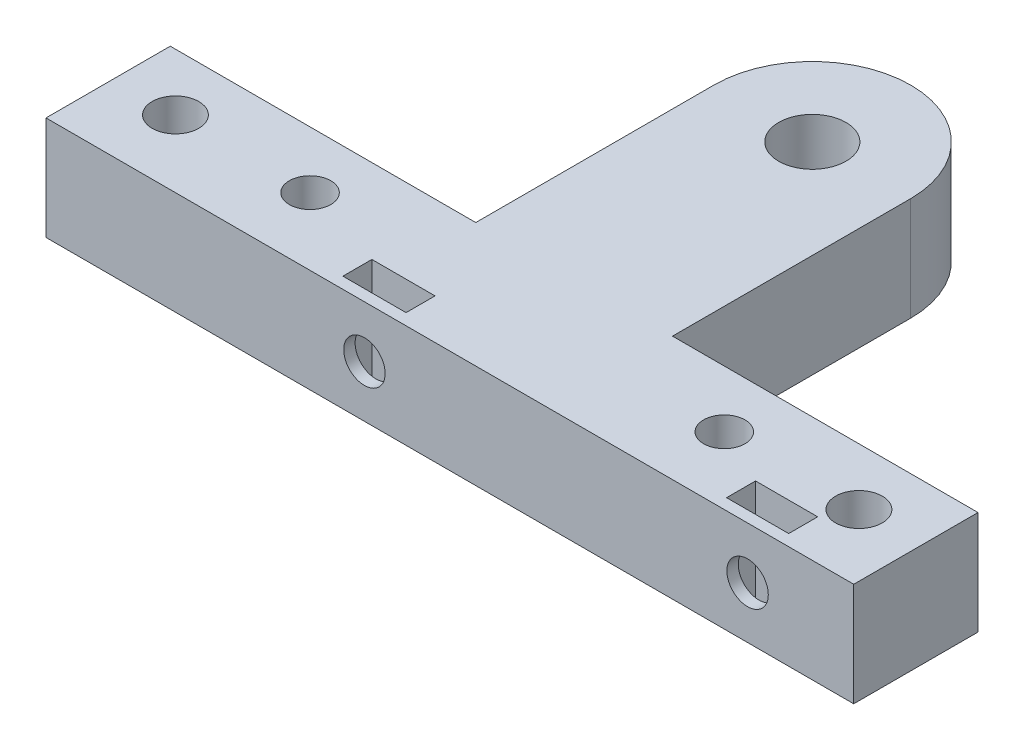
ISO-10303-21;
HEADER;
FILE_DESCRIPTION(('STEP AP214'),'2;1');
FILE_NAME('part.step','',(''),(''),'','','');
FILE_SCHEMA(('AUTOMOTIVE_DESIGN { 1 0 10303 214 1 1 1 1 }'));
ENDSEC;
DATA;
#1=APPLICATION_CONTEXT('core data for automotive mechanical design processes');
#2=APPLICATION_PROTOCOL_DEFINITION('international standard','automotive_design',2000,#1);
#3=PRODUCT_CONTEXT('',#1,'mechanical');
#4=PRODUCT('Part','Part','',(#3));
#5=PRODUCT_RELATED_PRODUCT_CATEGORY('part','',(#4));
#6=PRODUCT_DEFINITION_FORMATION('','',#4);
#7=PRODUCT_DEFINITION_CONTEXT('part definition',#1,'design');
#8=PRODUCT_DEFINITION('design','',#6,#7);
#9=PRODUCT_DEFINITION_SHAPE('','',#8);
#10=(LENGTH_UNIT() NAMED_UNIT(*) SI_UNIT(.MILLI.,.METRE.));
#11=(NAMED_UNIT(*) PLANE_ANGLE_UNIT() SI_UNIT($,.RADIAN.));
#12=(NAMED_UNIT(*) SI_UNIT($,.STERADIAN.) SOLID_ANGLE_UNIT());
#13=UNCERTAINTY_MEASURE_WITH_UNIT(LENGTH_MEASURE(1.E-05),#10,'distance_accuracy_value','');
#14=(GEOMETRIC_REPRESENTATION_CONTEXT(3) GLOBAL_UNCERTAINTY_ASSIGNED_CONTEXT((#13)) GLOBAL_UNIT_ASSIGNED_CONTEXT((#10,
#11,#12)) REPRESENTATION_CONTEXT('',''));
#15=CARTESIAN_POINT('',(0.,0.,0.));
#16=DIRECTION('',(0.,0.,1.));
#17=DIRECTION('',(1.,0.,0.));
#18=AXIS2_PLACEMENT_3D('',#15,#16,#17);
#19=CARTESIAN_POINT('',(28.75,5.,2.00000000000001));
#20=DIRECTION('',(0.,0.,1.));
#21=DIRECTION('',(1.,0.,0.));
#22=AXIS2_PLACEMENT_3D('',#19,#20,#21);
#23=CYLINDRICAL_SURFACE('',#22,2.);
#24=CARTESIAN_POINT('',(28.75,5.,4.9));
#25=DIRECTION('',(0.,0.,1.));
#26=DIRECTION('',(1.,0.,0.));
#27=AXIS2_PLACEMENT_3D('',#24,#25,#26);
#28=CIRCLE('',#27,2.);
#29=CARTESIAN_POINT('',(30.75,5.,4.9));
#30=VERTEX_POINT('',#29);
#31=EDGE_CURVE('E272',#30,#30,#28,.F.);
#32=ORIENTED_EDGE('',*,*,#31,.T.);
#33=EDGE_LOOP('',(#32));
#34=FACE_BOUND('',#33,.T.);
#35=CARTESIAN_POINT('',(28.75,5.,6.));
#36=DIRECTION('',(0.,0.,1.));
#37=DIRECTION('',(1.,0.,0.));
#38=AXIS2_PLACEMENT_3D('',#35,#36,#37);
#39=CIRCLE('',#38,2.);
#40=CARTESIAN_POINT('',(30.75,5.,6.));
#41=VERTEX_POINT('',#40);
#42=EDGE_CURVE('E269',#41,#41,#39,.T.);
#43=ORIENTED_EDGE('',*,*,#42,.T.);
#44=EDGE_LOOP('',(#43));
#45=FACE_BOUND('',#44,.T.);
#46=ADVANCED_FACE('F33',(#34,#45),#23,.F.);
#47=CARTESIAN_POINT('',(-8.25,5.,2.00000000000001));
#48=DIRECTION('',(0.,0.,1.));
#49=DIRECTION('',(1.,0.,0.));
#50=AXIS2_PLACEMENT_3D('',#47,#48,#49);
#51=CYLINDRICAL_SURFACE('',#50,2.);
#52=CARTESIAN_POINT('',(-8.25,5.,4.9));
#53=DIRECTION('',(0.,0.,1.));
#54=DIRECTION('',(1.,0.,0.));
#55=AXIS2_PLACEMENT_3D('',#52,#53,#54);
#56=CIRCLE('',#55,2.);
#57=CARTESIAN_POINT('',(-6.25,5.,4.9));
#58=VERTEX_POINT('',#57);
#59=EDGE_CURVE('E394',#58,#58,#56,.F.);
#60=ORIENTED_EDGE('',*,*,#59,.T.);
#61=EDGE_LOOP('',(#60));
#62=FACE_BOUND('',#61,.T.);
#63=CARTESIAN_POINT('',(-8.25,5.,6.));
#64=DIRECTION('',(0.,0.,1.));
#65=DIRECTION('',(1.,0.,0.));
#66=AXIS2_PLACEMENT_3D('',#63,#64,#65);
#67=CIRCLE('',#66,2.);
#68=CARTESIAN_POINT('',(-6.25,5.,6.));
#69=VERTEX_POINT('',#68);
#70=EDGE_CURVE('E263',#69,#69,#67,.T.);
#71=ORIENTED_EDGE('',*,*,#70,.T.);
#72=EDGE_LOOP('',(#71));
#73=FACE_BOUND('',#72,.T.);
#74=ADVANCED_FACE('F447',(#62,#73),#51,.F.);
#75=CARTESIAN_POINT('',(0.,10.,-29.));
#76=DIRECTION('',(0.,-1.,0.));
#77=DIRECTION('',(0.,0.,-1.));
#78=AXIS2_PLACEMENT_3D('',#75,#76,#77);
#79=CYLINDRICAL_SURFACE('',#78,3.25);
#80=CARTESIAN_POINT('',(0.,10.,-29.));
#81=DIRECTION('',(0.,1.,0.));
#82=DIRECTION('',(0.,0.,1.));
#83=AXIS2_PLACEMENT_3D('',#80,#81,#82);
#84=CIRCLE('',#83,3.25);
#85=CARTESIAN_POINT('',(0.,10.,-25.75));
#86=VERTEX_POINT('',#85);
#87=EDGE_CURVE('E331',#86,#86,#84,.T.);
#88=ORIENTED_EDGE('',*,*,#87,.T.);
#89=EDGE_LOOP('',(#88));
#90=FACE_BOUND('',#89,.T.);
#91=CARTESIAN_POINT('',(0.,5.,-29.));
#92=DIRECTION('',(0.,-1.,0.));
#93=DIRECTION('',(0.,0.,-1.));
#94=AXIS2_PLACEMENT_3D('',#91,#92,#93);
#95=CIRCLE('',#94,3.25);
#96=CARTESIAN_POINT('',(0.,5.,-32.25));
#97=VERTEX_POINT('',#96);
#98=EDGE_CURVE('E310',#97,#97,#95,.T.);
#99=ORIENTED_EDGE('',*,*,#98,.T.);
#100=EDGE_LOOP('',(#99));
#101=FACE_BOUND('',#100,.T.);
#102=ADVANCED_FACE('F452',(#90,#101),#79,.F.);
#103=CARTESIAN_POINT('',(0.,10.,-29.));
#104=DIRECTION('',(0.,1.,0.));
#105=DIRECTION('',(0.,0.,1.));
#106=AXIS2_PLACEMENT_3D('',#103,#104,#105);
#107=PLANE('',#106);
#108=CARTESIAN_POINT('',(-20.,10.,-0.499999999999998));
#109=DIRECTION('',(0.,1.,0.));
#110=DIRECTION('',(0.,0.,1.));
#111=AXIS2_PLACEMENT_3D('',#108,#109,#110);
#112=CIRCLE('',#111,2.);
#113=CARTESIAN_POINT('',(-20.,10.,1.5));
#114=VERTEX_POINT('',#113);
#115=EDGE_CURVE('E403',#114,#114,#112,.T.);
#116=ORIENTED_EDGE('',*,*,#115,.F.);
#117=EDGE_LOOP('',(#116));
#118=FACE_BOUND('',#117,.T.);
#119=CARTESIAN_POINT('',(20.,10.,-0.499999999999998));
#120=DIRECTION('',(0.,1.,0.));
#121=DIRECTION('',(0.,0.,1.));
#122=AXIS2_PLACEMENT_3D('',#119,#120,#121);
#123=CIRCLE('',#122,2.);
#124=CARTESIAN_POINT('',(20.,10.,1.5));
#125=VERTEX_POINT('',#124);
#126=EDGE_CURVE('E408',#125,#125,#123,.T.);
#127=ORIENTED_EDGE('',*,*,#126,.F.);
#128=EDGE_LOOP('',(#127));
#129=FACE_BOUND('',#128,.T.);
#130=DIRECTION('',(0.,0.,-1.));
#131=VECTOR('',#130,1.);
#132=CARTESIAN_POINT('',(-5.33087352716779,10.,2.1));
#133=LINE('',#132,#131);
#134=CARTESIAN_POINT('',(-5.33087352716779,10.,4.9));
#135=VERTEX_POINT('',#134);
#136=CARTESIAN_POINT('',(-5.33087352716779,10.,2.1));
#137=VERTEX_POINT('',#136);
#138=EDGE_CURVE('E50',#135,#137,#133,.T.);
#139=ORIENTED_EDGE('',*,*,#138,.F.);
#140=DIRECTION('',(1.,0.,0.));
#141=VECTOR('',#140,1.);
#142=CARTESIAN_POINT('',(-11.4308735271678,10.,4.9));
#143=LINE('',#142,#141);
#144=CARTESIAN_POINT('',(-11.4308735271678,10.,4.9));
#145=VERTEX_POINT('',#144);
#146=EDGE_CURVE('E206',#145,#135,#143,.T.);
#147=ORIENTED_EDGE('',*,*,#146,.F.);
#148=DIRECTION('',(0.,0.,1.));
#149=VECTOR('',#148,1.);
#150=CARTESIAN_POINT('',(-11.4308735271678,10.,2.1));
#151=LINE('',#150,#149);
#152=CARTESIAN_POINT('',(-11.4308735271678,10.,2.1));
#153=VERTEX_POINT('',#152);
#154=EDGE_CURVE('E209',#153,#145,#151,.T.);
#155=ORIENTED_EDGE('',*,*,#154,.F.);
#156=DIRECTION('',(-1.,0.,0.));
#157=VECTOR('',#156,1.);
#158=CARTESIAN_POINT('',(-11.4308735271678,10.,2.1));
#159=LINE('',#158,#157);
#160=EDGE_CURVE('E218',#137,#153,#159,.T.);
#161=ORIENTED_EDGE('',*,*,#160,.F.);
#162=EDGE_LOOP('',(#139,#147,#155,#161));
#163=FACE_BOUND('',#162,.T.);
#164=DIRECTION('',(0.,0.,-1.));
#165=VECTOR('',#164,1.);
#166=CARTESIAN_POINT('',(31.6191264728322,10.,2.1));
#167=LINE('',#166,#165);
#168=CARTESIAN_POINT('',(31.6191264728322,10.,4.9));
#169=VERTEX_POINT('',#168);
#170=CARTESIAN_POINT('',(31.6191264728322,10.,2.1));
#171=VERTEX_POINT('',#170);
#172=EDGE_CURVE('E58',#169,#171,#167,.T.);
#173=ORIENTED_EDGE('',*,*,#172,.F.);
#174=DIRECTION('',(1.,0.,0.));
#175=VECTOR('',#174,1.);
#176=CARTESIAN_POINT('',(25.6191264728322,10.,4.9));
#177=LINE('',#176,#175);
#178=CARTESIAN_POINT('',(25.6191264728322,10.,4.9));
#179=VERTEX_POINT('',#178);
#180=EDGE_CURVE('E233',#179,#169,#177,.T.);
#181=ORIENTED_EDGE('',*,*,#180,.F.);
#182=DIRECTION('',(0.,0.,1.));
#183=VECTOR('',#182,1.);
#184=CARTESIAN_POINT('',(25.6191264728322,10.,2.1));
#185=LINE('',#184,#183);
#186=CARTESIAN_POINT('',(25.6191264728322,10.,2.1));
#187=VERTEX_POINT('',#186);
#188=EDGE_CURVE('E248',#187,#179,#185,.T.);
#189=ORIENTED_EDGE('',*,*,#188,.F.);
#190=DIRECTION('',(-1.,0.,0.));
#191=VECTOR('',#190,1.);
#192=CARTESIAN_POINT('',(25.6191264728322,10.,2.1));
#193=LINE('',#192,#191);
#194=EDGE_CURVE('E244',#171,#187,#193,.T.);
#195=ORIENTED_EDGE('',*,*,#194,.F.);
#196=EDGE_LOOP('',(#173,#181,#189,#195));
#197=FACE_BOUND('',#196,.T.);
#198=CARTESIAN_POINT('',(-33.,10.,-0.499999999999998));
#199=DIRECTION('',(0.,1.,0.));
#200=DIRECTION('',(0.,0.,1.));
#201=AXIS2_PLACEMENT_3D('',#198,#199,#200);
#202=CIRCLE('',#201,2.25);
#203=CARTESIAN_POINT('',(-33.,10.,1.75));
#204=VERTEX_POINT('',#203);
#205=EDGE_CURVE('E328',#204,#204,#202,.T.);
#206=ORIENTED_EDGE('',*,*,#205,.F.);
#207=EDGE_LOOP('',(#206));
#208=FACE_BOUND('',#207,.T.);
#209=DIRECTION('',(0.,0.,-1.));
#210=VECTOR('',#209,1.);
#211=CARTESIAN_POINT('',(39.,10.,-6.));
#212=LINE('',#211,#210);
#213=CARTESIAN_POINT('',(39.,10.,6.));
#214=VERTEX_POINT('',#213);
#215=CARTESIAN_POINT('',(39.,10.,-6.));
#216=VERTEX_POINT('',#215);
#217=EDGE_CURVE('E337',#214,#216,#212,.T.);
#218=ORIENTED_EDGE('',*,*,#217,.T.);
#219=DIRECTION('',(-1.,0.,0.));
#220=VECTOR('',#219,1.);
#221=CARTESIAN_POINT('',(9.5,10.,-6.));
#222=LINE('',#221,#220);
#223=CARTESIAN_POINT('',(9.5,10.,-6.));
#224=VERTEX_POINT('',#223);
#225=EDGE_CURVE('E340',#216,#224,#222,.T.);
#226=ORIENTED_EDGE('',*,*,#225,.T.);
#227=DIRECTION('',(0.,0.,-1.));
#228=VECTOR('',#227,1.);
#229=CARTESIAN_POINT('',(9.5,10.,-29.));
#230=LINE('',#229,#228);
#231=CARTESIAN_POINT('',(9.5,10.,-29.));
#232=VERTEX_POINT('',#231);
#233=EDGE_CURVE('E343',#224,#232,#230,.T.);
#234=ORIENTED_EDGE('',*,*,#233,.T.);
#235=CARTESIAN_POINT('',(0.,10.,-29.));
#236=DIRECTION('',(0.,1.,0.));
#237=DIRECTION('',(0.,0.,1.));
#238=AXIS2_PLACEMENT_3D('',#235,#236,#237);
#239=CIRCLE('',#238,9.5);
#240=CARTESIAN_POINT('',(-9.5,10.,-29.));
#241=VERTEX_POINT('',#240);
#242=EDGE_CURVE('E345',#232,#241,#239,.T.);
#243=ORIENTED_EDGE('',*,*,#242,.T.);
#244=DIRECTION('',(0.,0.,1.));
#245=VECTOR('',#244,1.);
#246=CARTESIAN_POINT('',(-9.5,10.,-6.));
#247=LINE('',#246,#245);
#248=CARTESIAN_POINT('',(-9.5,10.,-6.));
#249=VERTEX_POINT('',#248);
#250=EDGE_CURVE('E347',#241,#249,#247,.T.);
#251=ORIENTED_EDGE('',*,*,#250,.T.);
#252=DIRECTION('',(-1.,0.,0.));
#253=VECTOR('',#252,1.);
#254=CARTESIAN_POINT('',(-39.,10.,-6.));
#255=LINE('',#254,#253);
#256=CARTESIAN_POINT('',(-39.,10.,-6.));
#257=VERTEX_POINT('',#256);
#258=EDGE_CURVE('E349',#249,#257,#255,.T.);
#259=ORIENTED_EDGE('',*,*,#258,.T.);
#260=DIRECTION('',(0.,0.,1.));
#261=VECTOR('',#260,1.);
#262=CARTESIAN_POINT('',(-39.,10.,-6.));
#263=LINE('',#262,#261);
#264=CARTESIAN_POINT('',(-39.,10.,6.));
#265=VERTEX_POINT('',#264);
#266=EDGE_CURVE('E351',#257,#265,#263,.T.);
#267=ORIENTED_EDGE('',*,*,#266,.T.);
#268=DIRECTION('',(1.,0.,0.));
#269=VECTOR('',#268,1.);
#270=CARTESIAN_POINT('',(-39.,10.,6.));
#271=LINE('',#270,#269);
#272=EDGE_CURVE('E353',#265,#214,#271,.T.);
#273=ORIENTED_EDGE('',*,*,#272,.T.);
#274=EDGE_LOOP('',(#218,#226,#234,#243,#251,#259,#267,#273));
#275=FACE_BOUND('',#274,.T.);
#276=ORIENTED_EDGE('',*,*,#87,.F.);
#277=EDGE_LOOP('',(#276));
#278=FACE_BOUND('',#277,.T.);
#279=CARTESIAN_POINT('',(33.,10.,-0.499999999999998));
#280=DIRECTION('',(0.,1.,0.));
#281=DIRECTION('',(0.,0.,-1.));
#282=AXIS2_PLACEMENT_3D('',#279,#280,#281);
#283=CIRCLE('',#282,2.25);
#284=CARTESIAN_POINT('',(33.,10.,-2.75));
#285=VERTEX_POINT('',#284);
#286=EDGE_CURVE('E321',#285,#285,#283,.T.);
#287=ORIENTED_EDGE('',*,*,#286,.F.);
#288=EDGE_LOOP('',(#287));
#289=FACE_BOUND('',#288,.T.);
#290=ADVANCED_FACE('F484',(#118,#129,#163,#197,#208,#275,#278,#289),#107,.T.);
#291=CARTESIAN_POINT('',(0.,0.,-29.));
#292=DIRECTION('',(0.,1.,0.));
#293=DIRECTION('',(0.,0.,1.));
#294=AXIS2_PLACEMENT_3D('',#291,#292,#293);
#295=PLANE('',#294);
#296=CARTESIAN_POINT('',(-20.,0.,-0.499999999999998));
#297=DIRECTION('',(0.,1.,0.));
#298=DIRECTION('',(0.,0.,1.));
#299=AXIS2_PLACEMENT_3D('',#296,#297,#298);
#300=CIRCLE('',#299,2.);
#301=CARTESIAN_POINT('',(-20.,0.,1.5));
#302=VERTEX_POINT('',#301);
#303=EDGE_CURVE('E37',#302,#302,#300,.T.);
#304=ORIENTED_EDGE('',*,*,#303,.T.);
#305=EDGE_LOOP('',(#304));
#306=FACE_BOUND('',#305,.T.);
#307=CARTESIAN_POINT('',(20.,0.,-0.499999999999998));
#308=DIRECTION('',(0.,1.,0.));
#309=DIRECTION('',(0.,0.,1.));
#310=AXIS2_PLACEMENT_3D('',#307,#308,#309);
#311=CIRCLE('',#310,2.);
#312=CARTESIAN_POINT('',(20.,0.,1.5));
#313=VERTEX_POINT('',#312);
#314=EDGE_CURVE('E401',#313,#313,#311,.T.);
#315=ORIENTED_EDGE('',*,*,#314,.T.);
#316=EDGE_LOOP('',(#315));
#317=FACE_BOUND('',#316,.T.);
#318=DIRECTION('',(1.,0.,0.));
#319=VECTOR('',#318,1.);
#320=CARTESIAN_POINT('',(-11.4308735271678,0.,4.9));
#321=LINE('',#320,#319);
#322=CARTESIAN_POINT('',(-11.4308735271678,0.,4.9));
#323=VERTEX_POINT('',#322);
#324=CARTESIAN_POINT('',(-5.33087352716779,0.,4.9));
#325=VERTEX_POINT('',#324);
#326=EDGE_CURVE('E192',#323,#325,#321,.T.);
#327=ORIENTED_EDGE('',*,*,#326,.T.);
#328=DIRECTION('',(0.,0.,-1.));
#329=VECTOR('',#328,1.);
#330=CARTESIAN_POINT('',(-5.33087352716779,0.,2.1));
#331=LINE('',#330,#329);
#332=CARTESIAN_POINT('',(-5.33087352716779,0.,2.1));
#333=VERTEX_POINT('',#332);
#334=EDGE_CURVE('E186',#325,#333,#331,.T.);
#335=ORIENTED_EDGE('',*,*,#334,.T.);
#336=DIRECTION('',(-1.,0.,0.));
#337=VECTOR('',#336,1.);
#338=CARTESIAN_POINT('',(-11.4308735271678,0.,2.1));
#339=LINE('',#338,#337);
#340=CARTESIAN_POINT('',(-11.4308735271678,0.,2.1));
#341=VERTEX_POINT('',#340);
#342=EDGE_CURVE('E196',#333,#341,#339,.T.);
#343=ORIENTED_EDGE('',*,*,#342,.T.);
#344=DIRECTION('',(0.,0.,1.));
#345=VECTOR('',#344,1.);
#346=CARTESIAN_POINT('',(-11.4308735271678,0.,2.1));
#347=LINE('',#346,#345);
#348=EDGE_CURVE('E201',#341,#323,#347,.T.);
#349=ORIENTED_EDGE('',*,*,#348,.T.);
#350=EDGE_LOOP('',(#327,#335,#343,#349));
#351=FACE_BOUND('',#350,.T.);
#352=DIRECTION('',(1.,0.,0.));
#353=VECTOR('',#352,1.);
#354=CARTESIAN_POINT('',(25.6191264728322,0.,4.9));
#355=LINE('',#354,#353);
#356=CARTESIAN_POINT('',(25.6191264728322,0.,4.9));
#357=VERTEX_POINT('',#356);
#358=CARTESIAN_POINT('',(31.6191264728322,0.,4.9));
#359=VERTEX_POINT('',#358);
#360=EDGE_CURVE('E239',#357,#359,#355,.T.);
#361=ORIENTED_EDGE('',*,*,#360,.T.);
#362=DIRECTION('',(0.,0.,-1.));
#363=VECTOR('',#362,1.);
#364=CARTESIAN_POINT('',(31.6191264728322,0.,2.1));
#365=LINE('',#364,#363);
#366=CARTESIAN_POINT('',(31.6191264728322,0.,2.1));
#367=VERTEX_POINT('',#366);
#368=EDGE_CURVE('E229',#359,#367,#365,.T.);
#369=ORIENTED_EDGE('',*,*,#368,.T.);
#370=DIRECTION('',(-1.,0.,0.));
#371=VECTOR('',#370,1.);
#372=CARTESIAN_POINT('',(25.6191264728322,0.,2.1));
#373=LINE('',#372,#371);
#374=CARTESIAN_POINT('',(25.6191264728322,0.,2.1));
#375=VERTEX_POINT('',#374);
#376=EDGE_CURVE('E232',#367,#375,#373,.T.);
#377=ORIENTED_EDGE('',*,*,#376,.T.);
#378=DIRECTION('',(0.,0.,1.));
#379=VECTOR('',#378,1.);
#380=CARTESIAN_POINT('',(25.6191264728322,0.,2.1));
#381=LINE('',#380,#379);
#382=EDGE_CURVE('E236',#375,#357,#381,.T.);
#383=ORIENTED_EDGE('',*,*,#382,.T.);
#384=EDGE_LOOP('',(#361,#369,#377,#383));
#385=FACE_BOUND('',#384,.T.);
#386=DIRECTION('',(-0.5,0.,0.866025403784438));
#387=VECTOR('',#386,1.);
#388=CARTESIAN_POINT('',(5.75,0.,-29.));
#389=LINE('',#388,#387);
#390=CARTESIAN_POINT('',(5.75,0.,-29.));
#391=VERTEX_POINT('',#390);
#392=CARTESIAN_POINT('',(2.875,0.,-24.0203539282395));
#393=VERTEX_POINT('',#392);
#394=EDGE_CURVE('E294',#391,#393,#389,.T.);
#395=ORIENTED_EDGE('',*,*,#394,.F.);
#396=DIRECTION('',(0.499999999999999,0.,0.866025403784439));
#397=VECTOR('',#396,1.);
#398=CARTESIAN_POINT('',(2.875,0.,-33.9796460717605));
#399=LINE('',#398,#397);
#400=CARTESIAN_POINT('',(2.875,0.,-33.9796460717605));
#401=VERTEX_POINT('',#400);
#402=EDGE_CURVE('E262',#401,#391,#399,.T.);
#403=ORIENTED_EDGE('',*,*,#402,.F.);
#404=DIRECTION('',(1.,0.,0.));
#405=VECTOR('',#404,1.);
#406=CARTESIAN_POINT('',(-2.875,0.,-33.9796460717605));
#407=LINE('',#406,#405);
#408=CARTESIAN_POINT('',(-2.875,0.,-33.9796460717605));
#409=VERTEX_POINT('',#408);
#410=EDGE_CURVE('E277',#409,#401,#407,.T.);
#411=ORIENTED_EDGE('',*,*,#410,.F.);
#412=DIRECTION('',(0.5,0.,-0.866025403784439));
#413=VECTOR('',#412,1.);
#414=CARTESIAN_POINT('',(-5.75,0.,-29.));
#415=LINE('',#414,#413);
#416=CARTESIAN_POINT('',(-5.75,0.,-29.));
#417=VERTEX_POINT('',#416);
#418=EDGE_CURVE('E303',#417,#409,#415,.T.);
#419=ORIENTED_EDGE('',*,*,#418,.F.);
#420=DIRECTION('',(-0.5,0.,-0.866025403784439));
#421=VECTOR('',#420,1.);
#422=CARTESIAN_POINT('',(-2.875,0.,-24.0203539282395));
#423=LINE('',#422,#421);
#424=CARTESIAN_POINT('',(-2.875,0.,-24.0203539282395));
#425=VERTEX_POINT('',#424);
#426=EDGE_CURVE('E300',#425,#417,#423,.T.);
#427=ORIENTED_EDGE('',*,*,#426,.F.);
#428=DIRECTION('',(-1.,0.,0.));
#429=VECTOR('',#428,1.);
#430=CARTESIAN_POINT('',(2.875,0.,-24.0203539282395));
#431=LINE('',#430,#429);
#432=EDGE_CURVE('E297',#393,#425,#431,.T.);
#433=ORIENTED_EDGE('',*,*,#432,.F.);
#434=EDGE_LOOP('',(#395,#403,#411,#419,#427,#433));
#435=FACE_BOUND('',#434,.T.);
#436=DIRECTION('',(0.,0.,-1.));
#437=VECTOR('',#436,1.);
#438=CARTESIAN_POINT('',(39.,0.,-6.));
#439=LINE('',#438,#437);
#440=CARTESIAN_POINT('',(39.,0.,6.));
#441=VERTEX_POINT('',#440);
#442=CARTESIAN_POINT('',(39.,0.,-6.));
#443=VERTEX_POINT('',#442);
#444=EDGE_CURVE('E336',#441,#443,#439,.T.);
#445=ORIENTED_EDGE('',*,*,#444,.F.);
#446=DIRECTION('',(1.,0.,0.));
#447=VECTOR('',#446,1.);
#448=CARTESIAN_POINT('',(-39.,0.,6.));
#449=LINE('',#448,#447);
#450=CARTESIAN_POINT('',(-39.,0.,6.));
#451=VERTEX_POINT('',#450);
#452=EDGE_CURVE('E341',#451,#441,#449,.T.);
#453=ORIENTED_EDGE('',*,*,#452,.F.);
#454=DIRECTION('',(0.,0.,1.));
#455=VECTOR('',#454,1.);
#456=CARTESIAN_POINT('',(-39.,0.,-6.));
#457=LINE('',#456,#455);
#458=CARTESIAN_POINT('',(-39.,0.,-6.));
#459=VERTEX_POINT('',#458);
#460=EDGE_CURVE('E368',#459,#451,#457,.T.);
#461=ORIENTED_EDGE('',*,*,#460,.F.);
#462=DIRECTION('',(-1.,0.,0.));
#463=VECTOR('',#462,1.);
#464=CARTESIAN_POINT('',(-39.,0.,-6.));
#465=LINE('',#464,#463);
#466=CARTESIAN_POINT('',(-9.5,0.,-6.));
#467=VERTEX_POINT('',#466);
#468=EDGE_CURVE('E366',#467,#459,#465,.T.);
#469=ORIENTED_EDGE('',*,*,#468,.F.);
#470=DIRECTION('',(0.,0.,1.));
#471=VECTOR('',#470,1.);
#472=CARTESIAN_POINT('',(-9.5,0.,-6.));
#473=LINE('',#472,#471);
#474=CARTESIAN_POINT('',(-9.5,0.,-29.));
#475=VERTEX_POINT('',#474);
#476=EDGE_CURVE('E364',#475,#467,#473,.T.);
#477=ORIENTED_EDGE('',*,*,#476,.F.);
#478=CARTESIAN_POINT('',(0.,0.,-29.));
#479=DIRECTION('',(0.,1.,0.));
#480=DIRECTION('',(0.,0.,1.));
#481=AXIS2_PLACEMENT_3D('',#478,#479,#480);
#482=CIRCLE('',#481,9.5);
#483=CARTESIAN_POINT('',(9.5,0.,-29.));
#484=VERTEX_POINT('',#483);
#485=EDGE_CURVE('E362',#484,#475,#482,.T.);
#486=ORIENTED_EDGE('',*,*,#485,.F.);
#487=DIRECTION('',(0.,0.,-1.));
#488=VECTOR('',#487,1.);
#489=CARTESIAN_POINT('',(9.5,0.,-29.));
#490=LINE('',#489,#488);
#491=CARTESIAN_POINT('',(9.5,0.,-6.));
#492=VERTEX_POINT('',#491);
#493=EDGE_CURVE('E360',#492,#484,#490,.T.);
#494=ORIENTED_EDGE('',*,*,#493,.F.);
#495=DIRECTION('',(-1.,0.,0.));
#496=VECTOR('',#495,1.);
#497=CARTESIAN_POINT('',(9.5,0.,-6.));
#498=LINE('',#497,#496);
#499=EDGE_CURVE('E358',#443,#492,#498,.T.);
#500=ORIENTED_EDGE('',*,*,#499,.F.);
#501=EDGE_LOOP('',(#445,#453,#461,#469,#477,#486,#494,#500));
#502=FACE_BOUND('',#501,.T.);
#503=CARTESIAN_POINT('',(-33.,0.,-0.499999999999998));
#504=DIRECTION('',(0.,1.,0.));
#505=DIRECTION('',(0.,0.,1.));
#506=AXIS2_PLACEMENT_3D('',#503,#504,#505);
#507=CIRCLE('',#506,2.25);
#508=CARTESIAN_POINT('',(-33.,0.,1.75));
#509=VERTEX_POINT('',#508);
#510=EDGE_CURVE('E324',#509,#509,#507,.T.);
#511=ORIENTED_EDGE('',*,*,#510,.T.);
#512=EDGE_LOOP('',(#511));
#513=FACE_BOUND('',#512,.T.);
#514=CARTESIAN_POINT('',(33.,0.,-0.499999999999998));
#515=DIRECTION('',(0.,1.,0.));
#516=DIRECTION('',(0.,0.,-1.));
#517=AXIS2_PLACEMENT_3D('',#514,#515,#516);
#518=CIRCLE('',#517,2.25);
#519=CARTESIAN_POINT('',(33.,0.,-2.75));
#520=VERTEX_POINT('',#519);
#521=EDGE_CURVE('E325',#520,#520,#518,.T.);
#522=ORIENTED_EDGE('',*,*,#521,.T.);
#523=EDGE_LOOP('',(#522));
#524=FACE_BOUND('',#523,.T.);
#525=ADVANCED_FACE('F203',(#306,#317,#351,#385,#435,#502,#513,#524),#295,.F.);
#526=CARTESIAN_POINT('',(39.,10.,-6.));
#527=DIRECTION('',(-1.,0.,0.));
#528=DIRECTION('',(0.,0.,1.));
#529=AXIS2_PLACEMENT_3D('',#526,#527,#528);
#530=PLANE('',#529);
#531=ORIENTED_EDGE('',*,*,#444,.T.);
#532=DIRECTION('',(0.,-1.,0.));
#533=VECTOR('',#532,1.);
#534=CARTESIAN_POINT('',(39.,10.,-6.));
#535=LINE('',#534,#533);
#536=EDGE_CURVE('E11',#216,#443,#535,.T.);
#537=ORIENTED_EDGE('',*,*,#536,.F.);
#538=ORIENTED_EDGE('',*,*,#217,.F.);
#539=DIRECTION('',(0.,-1.,0.));
#540=VECTOR('',#539,1.);
#541=CARTESIAN_POINT('',(39.,10.,6.));
#542=LINE('',#541,#540);
#543=EDGE_CURVE('E355',#214,#441,#542,.T.);
#544=ORIENTED_EDGE('',*,*,#543,.T.);
#545=EDGE_LOOP('',(#531,#537,#538,#544));
#546=FACE_BOUND('',#545,.T.);
#547=ADVANCED_FACE('F35',(#546),#530,.F.);
#548=CARTESIAN_POINT('',(9.5,10.,-6.));
#549=DIRECTION('',(0.,0.,1.));
#550=DIRECTION('',(1.,0.,0.));
#551=AXIS2_PLACEMENT_3D('',#548,#549,#550);
#552=PLANE('',#551);
#553=ORIENTED_EDGE('',*,*,#499,.T.);
#554=DIRECTION('',(0.,-1.,0.));
#555=VECTOR('',#554,1.);
#556=CARTESIAN_POINT('',(9.5,10.,-6.));
#557=LINE('',#556,#555);
#558=EDGE_CURVE('E42',#224,#492,#557,.T.);
#559=ORIENTED_EDGE('',*,*,#558,.F.);
#560=ORIENTED_EDGE('',*,*,#225,.F.);
#561=ORIENTED_EDGE('',*,*,#536,.T.);
#562=EDGE_LOOP('',(#553,#559,#560,#561));
#563=FACE_BOUND('',#562,.T.);
#564=ADVANCED_FACE('F481',(#563),#552,.F.);
#565=CARTESIAN_POINT('',(9.5,10.,-29.));
#566=DIRECTION('',(-1.,0.,0.));
#567=DIRECTION('',(0.,0.,1.));
#568=AXIS2_PLACEMENT_3D('',#565,#566,#567);
#569=PLANE('',#568);
#570=ORIENTED_EDGE('',*,*,#493,.T.);
#571=DIRECTION('',(0.,-1.,0.));
#572=VECTOR('',#571,1.);
#573=CARTESIAN_POINT('',(9.5,10.,-29.));
#574=LINE('',#573,#572);
#575=EDGE_CURVE('E385',#232,#484,#574,.T.);
#576=ORIENTED_EDGE('',*,*,#575,.F.);
#577=ORIENTED_EDGE('',*,*,#233,.F.);
#578=ORIENTED_EDGE('',*,*,#558,.T.);
#579=EDGE_LOOP('',(#570,#576,#577,#578));
#580=FACE_BOUND('',#579,.T.);
#581=ADVANCED_FACE('F504',(#580),#569,.F.);
#582=CARTESIAN_POINT('',(0.,10.,-29.));
#583=DIRECTION('',(0.,-1.,0.));
#584=DIRECTION('',(0.,0.,-1.));
#585=AXIS2_PLACEMENT_3D('',#582,#583,#584);
#586=CYLINDRICAL_SURFACE('',#585,9.5);
#587=ORIENTED_EDGE('',*,*,#485,.T.);
#588=DIRECTION('',(0.,-1.,0.));
#589=VECTOR('',#588,1.);
#590=CARTESIAN_POINT('',(-9.5,10.,-29.));
#591=LINE('',#590,#589);
#592=EDGE_CURVE('E382',#241,#475,#591,.T.);
#593=ORIENTED_EDGE('',*,*,#592,.F.);
#594=ORIENTED_EDGE('',*,*,#242,.F.);
#595=ORIENTED_EDGE('',*,*,#575,.T.);
#596=EDGE_LOOP('',(#587,#593,#594,#595));
#597=FACE_BOUND('',#596,.T.);
#598=ADVANCED_FACE('F501',(#597),#586,.T.);
#599=CARTESIAN_POINT('',(-9.5,10.,-6.));
#600=DIRECTION('',(1.,0.,0.));
#601=DIRECTION('',(0.,0.,-1.));
#602=AXIS2_PLACEMENT_3D('',#599,#600,#601);
#603=PLANE('',#602);
#604=ORIENTED_EDGE('',*,*,#476,.T.);
#605=DIRECTION('',(0.,-1.,0.));
#606=VECTOR('',#605,1.);
#607=CARTESIAN_POINT('',(-9.5,10.,-6.));
#608=LINE('',#607,#606);
#609=EDGE_CURVE('E379',#249,#467,#608,.T.);
#610=ORIENTED_EDGE('',*,*,#609,.F.);
#611=ORIENTED_EDGE('',*,*,#250,.F.);
#612=ORIENTED_EDGE('',*,*,#592,.T.);
#613=EDGE_LOOP('',(#604,#610,#611,#612));
#614=FACE_BOUND('',#613,.T.);
#615=ADVANCED_FACE('F497',(#614),#603,.F.);
#616=CARTESIAN_POINT('',(-39.,10.,-6.));
#617=DIRECTION('',(0.,0.,1.));
#618=DIRECTION('',(1.,0.,0.));
#619=AXIS2_PLACEMENT_3D('',#616,#617,#618);
#620=PLANE('',#619);
#621=ORIENTED_EDGE('',*,*,#468,.T.);
#622=DIRECTION('',(0.,-1.,0.));
#623=VECTOR('',#622,1.);
#624=CARTESIAN_POINT('',(-39.,10.,-6.));
#625=LINE('',#624,#623);
#626=EDGE_CURVE('E376',#257,#459,#625,.T.);
#627=ORIENTED_EDGE('',*,*,#626,.F.);
#628=ORIENTED_EDGE('',*,*,#258,.F.);
#629=ORIENTED_EDGE('',*,*,#609,.T.);
#630=EDGE_LOOP('',(#621,#627,#628,#629));
#631=FACE_BOUND('',#630,.T.);
#632=ADVANCED_FACE('F493',(#631),#620,.F.);
#633=CARTESIAN_POINT('',(-39.,10.,-6.));
#634=DIRECTION('',(1.,0.,0.));
#635=DIRECTION('',(0.,0.,-1.));
#636=AXIS2_PLACEMENT_3D('',#633,#634,#635);
#637=PLANE('',#636);
#638=ORIENTED_EDGE('',*,*,#460,.T.);
#639=DIRECTION('',(0.,-1.,0.));
#640=VECTOR('',#639,1.);
#641=CARTESIAN_POINT('',(-39.,10.,6.));
#642=LINE('',#641,#640);
#643=EDGE_CURVE('E373',#265,#451,#642,.T.);
#644=ORIENTED_EDGE('',*,*,#643,.F.);
#645=ORIENTED_EDGE('',*,*,#266,.F.);
#646=ORIENTED_EDGE('',*,*,#626,.T.);
#647=EDGE_LOOP('',(#638,#644,#645,#646));
#648=FACE_BOUND('',#647,.T.);
#649=ADVANCED_FACE('F463',(#648),#637,.F.);
#650=CARTESIAN_POINT('',(-39.,10.,6.));
#651=DIRECTION('',(0.,0.,-1.));
#652=DIRECTION('',(-1.,0.,0.));
#653=AXIS2_PLACEMENT_3D('',#650,#651,#652);
#654=PLANE('',#653);
#655=ORIENTED_EDGE('',*,*,#70,.F.);
#656=EDGE_LOOP('',(#655));
#657=FACE_BOUND('',#656,.T.);
#658=ORIENTED_EDGE('',*,*,#42,.F.);
#659=EDGE_LOOP('',(#658));
#660=FACE_BOUND('',#659,.T.);
#661=ORIENTED_EDGE('',*,*,#452,.T.);
#662=ORIENTED_EDGE('',*,*,#543,.F.);
#663=ORIENTED_EDGE('',*,*,#272,.F.);
#664=ORIENTED_EDGE('',*,*,#643,.T.);
#665=EDGE_LOOP('',(#661,#662,#663,#664));
#666=FACE_BOUND('',#665,.T.);
#667=ADVANCED_FACE('F459',(#657,#660,#666),#654,.F.);
#668=CARTESIAN_POINT('',(-33.,10.,-0.499999999999998));
#669=DIRECTION('',(0.,-1.,0.));
#670=DIRECTION('',(0.,0.,-1.));
#671=AXIS2_PLACEMENT_3D('',#668,#669,#670);
#672=CYLINDRICAL_SURFACE('',#671,2.25);
#673=ORIENTED_EDGE('',*,*,#205,.T.);
#674=EDGE_LOOP('',(#673));
#675=FACE_BOUND('',#674,.T.);
#676=ORIENTED_EDGE('',*,*,#510,.F.);
#677=EDGE_LOOP('',(#676));
#678=FACE_BOUND('',#677,.T.);
#679=ADVANCED_FACE('F462',(#675,#678),#672,.F.);
#680=CARTESIAN_POINT('',(33.,10.,-0.499999999999998));
#681=DIRECTION('',(0.,-1.,0.));
#682=DIRECTION('',(0.,0.,-1.));
#683=AXIS2_PLACEMENT_3D('',#680,#681,#682);
#684=CYLINDRICAL_SURFACE('',#683,2.25);
#685=ORIENTED_EDGE('',*,*,#286,.T.);
#686=EDGE_LOOP('',(#685));
#687=FACE_BOUND('',#686,.T.);
#688=ORIENTED_EDGE('',*,*,#521,.F.);
#689=EDGE_LOOP('',(#688));
#690=FACE_BOUND('',#689,.T.);
#691=ADVANCED_FACE('F530',(#687,#690),#684,.F.);
#692=CARTESIAN_POINT('',(2.875,5.,-33.9796460717605));
#693=DIRECTION('',(0.866025403784439,0.,-0.499999999999999));
#694=DIRECTION('',(-0.499999999999999,0.,-0.866025403784439));
#695=AXIS2_PLACEMENT_3D('',#692,#693,#694);
#696=PLANE('',#695);
#697=ORIENTED_EDGE('',*,*,#402,.T.);
#698=DIRECTION('',(0.,-1.,0.));
#699=VECTOR('',#698,1.);
#700=CARTESIAN_POINT('',(5.75,5.,-29.));
#701=LINE('',#700,#699);
#702=CARTESIAN_POINT('',(5.75,5.,-29.));
#703=VERTEX_POINT('',#702);
#704=EDGE_CURVE('E292',#703,#391,#701,.T.);
#705=ORIENTED_EDGE('',*,*,#704,.F.);
#706=DIRECTION('',(0.499999999999999,0.,0.866025403784439));
#707=VECTOR('',#706,1.);
#708=CARTESIAN_POINT('',(2.875,5.,-33.9796460717605));
#709=LINE('',#708,#707);
#710=CARTESIAN_POINT('',(2.875,5.,-33.9796460717605));
#711=VERTEX_POINT('',#710);
#712=EDGE_CURVE('E273',#711,#703,#709,.T.);
#713=ORIENTED_EDGE('',*,*,#712,.F.);
#714=DIRECTION('',(0.,-1.,0.));
#715=VECTOR('',#714,1.);
#716=CARTESIAN_POINT('',(2.875,5.,-33.9796460717605));
#717=LINE('',#716,#715);
#718=EDGE_CURVE('E308',#711,#401,#717,.T.);
#719=ORIENTED_EDGE('',*,*,#718,.T.);
#720=EDGE_LOOP('',(#697,#705,#713,#719));
#721=FACE_BOUND('',#720,.T.);
#722=ADVANCED_FACE('F534',(#721),#696,.F.);
#723=CARTESIAN_POINT('',(-2.875,5.,-33.9796460717605));
#724=DIRECTION('',(0.,0.,-1.));
#725=DIRECTION('',(-1.,0.,0.));
#726=AXIS2_PLACEMENT_3D('',#723,#724,#725);
#727=PLANE('',#726);
#728=ORIENTED_EDGE('',*,*,#410,.T.);
#729=ORIENTED_EDGE('',*,*,#718,.F.);
#730=DIRECTION('',(1.,0.,0.));
#731=VECTOR('',#730,1.);
#732=CARTESIAN_POINT('',(-2.875,5.,-33.9796460717605));
#733=LINE('',#732,#731);
#734=CARTESIAN_POINT('',(-2.875,5.,-33.9796460717605));
#735=VERTEX_POINT('',#734);
#736=EDGE_CURVE('E289',#735,#711,#733,.T.);
#737=ORIENTED_EDGE('',*,*,#736,.F.);
#738=DIRECTION('',(0.,-1.,0.));
#739=VECTOR('',#738,1.);
#740=CARTESIAN_POINT('',(-2.875,5.,-33.9796460717605));
#741=LINE('',#740,#739);
#742=EDGE_CURVE('E311',#735,#409,#741,.T.);
#743=ORIENTED_EDGE('',*,*,#742,.T.);
#744=EDGE_LOOP('',(#728,#729,#737,#743));
#745=FACE_BOUND('',#744,.T.);
#746=ADVANCED_FACE('F538',(#745),#727,.F.);
#747=CARTESIAN_POINT('',(-5.75,5.,-29.));
#748=DIRECTION('',(-0.866025403784439,0.,-0.5));
#749=DIRECTION('',(-0.5,0.,0.866025403784439));
#750=AXIS2_PLACEMENT_3D('',#747,#748,#749);
#751=PLANE('',#750);
#752=ORIENTED_EDGE('',*,*,#418,.T.);
#753=ORIENTED_EDGE('',*,*,#742,.F.);
#754=DIRECTION('',(0.5,0.,-0.866025403784439));
#755=VECTOR('',#754,1.);
#756=CARTESIAN_POINT('',(-5.75,5.,-29.));
#757=LINE('',#756,#755);
#758=CARTESIAN_POINT('',(-5.75,5.,-29.));
#759=VERTEX_POINT('',#758);
#760=EDGE_CURVE('E286',#759,#735,#757,.T.);
#761=ORIENTED_EDGE('',*,*,#760,.F.);
#762=DIRECTION('',(0.,-1.,0.));
#763=VECTOR('',#762,1.);
#764=CARTESIAN_POINT('',(-5.75,5.,-29.));
#765=LINE('',#764,#763);
#766=EDGE_CURVE('E313',#759,#417,#765,.T.);
#767=ORIENTED_EDGE('',*,*,#766,.T.);
#768=EDGE_LOOP('',(#752,#753,#761,#767));
#769=FACE_BOUND('',#768,.T.);
#770=ADVANCED_FACE('F552',(#769),#751,.F.);
#771=CARTESIAN_POINT('',(-2.875,5.,-24.0203539282395));
#772=DIRECTION('',(-0.866025403784439,0.,0.5));
#773=DIRECTION('',(0.5,0.,0.866025403784439));
#774=AXIS2_PLACEMENT_3D('',#771,#772,#773);
#775=PLANE('',#774);
#776=ORIENTED_EDGE('',*,*,#426,.T.);
#777=ORIENTED_EDGE('',*,*,#766,.F.);
#778=DIRECTION('',(-0.5,0.,-0.866025403784439));
#779=VECTOR('',#778,1.);
#780=CARTESIAN_POINT('',(-2.875,5.,-24.0203539282395));
#781=LINE('',#780,#779);
#782=CARTESIAN_POINT('',(-2.875,5.,-24.0203539282395));
#783=VERTEX_POINT('',#782);
#784=EDGE_CURVE('E283',#783,#759,#781,.T.);
#785=ORIENTED_EDGE('',*,*,#784,.F.);
#786=DIRECTION('',(0.,-1.,0.));
#787=VECTOR('',#786,1.);
#788=CARTESIAN_POINT('',(-2.875,5.,-24.0203539282395));
#789=LINE('',#788,#787);
#790=EDGE_CURVE('E315',#783,#425,#789,.T.);
#791=ORIENTED_EDGE('',*,*,#790,.T.);
#792=EDGE_LOOP('',(#776,#777,#785,#791));
#793=FACE_BOUND('',#792,.T.);
#794=ADVANCED_FACE('F548',(#793),#775,.F.);
#795=CARTESIAN_POINT('',(2.875,5.,-24.0203539282395));
#796=DIRECTION('',(0.,0.,1.));
#797=DIRECTION('',(1.,0.,0.));
#798=AXIS2_PLACEMENT_3D('',#795,#796,#797);
#799=PLANE('',#798);
#800=ORIENTED_EDGE('',*,*,#432,.T.);
#801=ORIENTED_EDGE('',*,*,#790,.F.);
#802=DIRECTION('',(-1.,0.,0.));
#803=VECTOR('',#802,1.);
#804=CARTESIAN_POINT('',(2.875,5.,-24.0203539282395));
#805=LINE('',#804,#803);
#806=CARTESIAN_POINT('',(2.875,5.,-24.0203539282395));
#807=VERTEX_POINT('',#806);
#808=EDGE_CURVE('E280',#807,#783,#805,.T.);
#809=ORIENTED_EDGE('',*,*,#808,.F.);
#810=DIRECTION('',(0.,-1.,0.));
#811=VECTOR('',#810,1.);
#812=CARTESIAN_POINT('',(2.875,5.,-24.0203539282395));
#813=LINE('',#812,#811);
#814=EDGE_CURVE('E317',#807,#393,#813,.T.);
#815=ORIENTED_EDGE('',*,*,#814,.T.);
#816=EDGE_LOOP('',(#800,#801,#809,#815));
#817=FACE_BOUND('',#816,.T.);
#818=ADVANCED_FACE('F544',(#817),#799,.F.);
#819=CARTESIAN_POINT('',(5.75,5.,-29.));
#820=DIRECTION('',(0.866025403784438,0.,0.5));
#821=DIRECTION('',(0.5,0.,-0.866025403784438));
#822=AXIS2_PLACEMENT_3D('',#819,#820,#821);
#823=PLANE('',#822);
#824=ORIENTED_EDGE('',*,*,#394,.T.);
#825=ORIENTED_EDGE('',*,*,#814,.F.);
#826=DIRECTION('',(-0.5,0.,0.866025403784438));
#827=VECTOR('',#826,1.);
#828=CARTESIAN_POINT('',(5.75,5.,-29.));
#829=LINE('',#828,#827);
#830=EDGE_CURVE('E276',#703,#807,#829,.T.);
#831=ORIENTED_EDGE('',*,*,#830,.F.);
#832=ORIENTED_EDGE('',*,*,#704,.T.);
#833=EDGE_LOOP('',(#824,#825,#831,#832));
#834=FACE_BOUND('',#833,.T.);
#835=ADVANCED_FACE('F540',(#834),#823,.F.);
#836=CARTESIAN_POINT('',(0.,5.,0.));
#837=DIRECTION('',(0.,-1.,0.));
#838=DIRECTION('',(0.,0.,-1.));
#839=AXIS2_PLACEMENT_3D('',#836,#837,#838);
#840=PLANE('',#839);
#841=ORIENTED_EDGE('',*,*,#98,.F.);
#842=EDGE_LOOP('',(#841));
#843=FACE_BOUND('',#842,.T.);
#844=ORIENTED_EDGE('',*,*,#712,.T.);
#845=ORIENTED_EDGE('',*,*,#830,.T.);
#846=ORIENTED_EDGE('',*,*,#808,.T.);
#847=ORIENTED_EDGE('',*,*,#784,.T.);
#848=ORIENTED_EDGE('',*,*,#760,.T.);
#849=ORIENTED_EDGE('',*,*,#736,.T.);
#850=EDGE_LOOP('',(#844,#845,#846,#847,#848,#849));
#851=FACE_BOUND('',#850,.T.);
#852=ADVANCED_FACE('F543',(#843,#851),#840,.T.);
#853=CARTESIAN_POINT('',(-11.4308735271678,0.,4.9));
#854=DIRECTION('',(0.,0.,1.));
#855=DIRECTION('',(1.,0.,0.));
#856=AXIS2_PLACEMENT_3D('',#853,#854,#855);
#857=PLANE('',#856);
#858=ORIENTED_EDGE('',*,*,#146,.T.);
#859=DIRECTION('',(0.,1.,0.));
#860=VECTOR('',#859,1.);
#861=CARTESIAN_POINT('',(-5.33087352716779,0.,4.9));
#862=LINE('',#861,#860);
#863=EDGE_CURVE('E223',#325,#135,#862,.T.);
#864=ORIENTED_EDGE('',*,*,#863,.F.);
#865=ORIENTED_EDGE('',*,*,#326,.F.);
#866=DIRECTION('',(0.,1.,0.));
#867=VECTOR('',#866,1.);
#868=CARTESIAN_POINT('',(-11.4308735271678,0.,4.9));
#869=LINE('',#868,#867);
#870=EDGE_CURVE('E226',#323,#145,#869,.T.);
#871=ORIENTED_EDGE('',*,*,#870,.T.);
#872=EDGE_LOOP('',(#858,#864,#865,#871));
#873=FACE_BOUND('',#872,.T.);
#874=ORIENTED_EDGE('',*,*,#59,.F.);
#875=EDGE_LOOP('',(#874));
#876=FACE_BOUND('',#875,.T.);
#877=ADVANCED_FACE('F560',(#873,#876),#857,.F.);
#878=CARTESIAN_POINT('',(-11.4308735271678,0.,2.1));
#879=DIRECTION('',(0.,0.,-1.));
#880=DIRECTION('',(-1.,0.,0.));
#881=AXIS2_PLACEMENT_3D('',#878,#879,#880);
#882=PLANE('',#881);
#883=ORIENTED_EDGE('',*,*,#160,.T.);
#884=DIRECTION('',(0.,1.,0.));
#885=VECTOR('',#884,1.);
#886=CARTESIAN_POINT('',(-11.4308735271678,0.,2.1));
#887=LINE('',#886,#885);
#888=EDGE_CURVE('E191',#341,#153,#887,.T.);
#889=ORIENTED_EDGE('',*,*,#888,.F.);
#890=ORIENTED_EDGE('',*,*,#342,.F.);
#891=DIRECTION('',(0.,1.,0.));
#892=VECTOR('',#891,1.);
#893=CARTESIAN_POINT('',(-5.33087352716779,0.,2.1));
#894=LINE('',#893,#892);
#895=EDGE_CURVE('E182',#333,#137,#894,.T.);
#896=ORIENTED_EDGE('',*,*,#895,.T.);
#897=EDGE_LOOP('',(#883,#889,#890,#896));
#898=FACE_BOUND('',#897,.T.);
#899=CARTESIAN_POINT('',(-8.25,5.,2.1));
#900=DIRECTION('',(0.,0.,-1.));
#901=DIRECTION('',(-1.,0.,0.));
#902=AXIS2_PLACEMENT_3D('',#899,#900,#901);
#903=CIRCLE('',#902,2.);
#904=CARTESIAN_POINT('',(-10.25,5.,2.1));
#905=VERTEX_POINT('',#904);
#906=EDGE_CURVE('E225',#905,#905,#903,.F.);
#907=ORIENTED_EDGE('',*,*,#906,.F.);
#908=EDGE_LOOP('',(#907));
#909=FACE_BOUND('',#908,.T.);
#910=ADVANCED_FACE('F197',(#898,#909),#882,.F.);
#911=CARTESIAN_POINT('',(-5.33087352716779,0.,2.1));
#912=DIRECTION('',(1.,0.,0.));
#913=DIRECTION('',(0.,0.,-1.));
#914=AXIS2_PLACEMENT_3D('',#911,#912,#913);
#915=PLANE('',#914);
#916=ORIENTED_EDGE('',*,*,#138,.T.);
#917=ORIENTED_EDGE('',*,*,#895,.F.);
#918=ORIENTED_EDGE('',*,*,#334,.F.);
#919=ORIENTED_EDGE('',*,*,#863,.T.);
#920=EDGE_LOOP('',(#916,#917,#918,#919));
#921=FACE_BOUND('',#920,.T.);
#922=ADVANCED_FACE('F184',(#921),#915,.F.);
#923=CARTESIAN_POINT('',(-11.4308735271678,0.,2.1));
#924=DIRECTION('',(-1.,0.,0.));
#925=DIRECTION('',(0.,0.,1.));
#926=AXIS2_PLACEMENT_3D('',#923,#924,#925);
#927=PLANE('',#926);
#928=ORIENTED_EDGE('',*,*,#154,.T.);
#929=ORIENTED_EDGE('',*,*,#870,.F.);
#930=ORIENTED_EDGE('',*,*,#348,.F.);
#931=ORIENTED_EDGE('',*,*,#888,.T.);
#932=EDGE_LOOP('',(#928,#929,#930,#931));
#933=FACE_BOUND('',#932,.T.);
#934=ADVANCED_FACE('F590',(#933),#927,.F.);
#935=CARTESIAN_POINT('',(25.6191264728322,0.,4.9));
#936=DIRECTION('',(0.,0.,1.));
#937=DIRECTION('',(1.,0.,0.));
#938=AXIS2_PLACEMENT_3D('',#935,#936,#937);
#939=PLANE('',#938);
#940=ORIENTED_EDGE('',*,*,#180,.T.);
#941=DIRECTION('',(0.,1.,0.));
#942=VECTOR('',#941,1.);
#943=CARTESIAN_POINT('',(31.6191264728322,0.,4.9));
#944=LINE('',#943,#942);
#945=EDGE_CURVE('E219',#359,#169,#944,.T.);
#946=ORIENTED_EDGE('',*,*,#945,.F.);
#947=ORIENTED_EDGE('',*,*,#360,.F.);
#948=DIRECTION('',(0.,1.,0.));
#949=VECTOR('',#948,1.);
#950=CARTESIAN_POINT('',(25.6191264728322,0.,4.9));
#951=LINE('',#950,#949);
#952=EDGE_CURVE('E254',#357,#179,#951,.T.);
#953=ORIENTED_EDGE('',*,*,#952,.T.);
#954=EDGE_LOOP('',(#940,#946,#947,#953));
#955=FACE_BOUND('',#954,.T.);
#956=ORIENTED_EDGE('',*,*,#31,.F.);
#957=EDGE_LOOP('',(#956));
#958=FACE_BOUND('',#957,.T.);
#959=ADVANCED_FACE('F592',(#955,#958),#939,.F.);
#960=CARTESIAN_POINT('',(25.6191264728322,0.,2.1));
#961=DIRECTION('',(0.,0.,-1.));
#962=DIRECTION('',(-1.,0.,0.));
#963=AXIS2_PLACEMENT_3D('',#960,#961,#962);
#964=PLANE('',#963);
#965=ORIENTED_EDGE('',*,*,#194,.T.);
#966=DIRECTION('',(0.,1.,0.));
#967=VECTOR('',#966,1.);
#968=CARTESIAN_POINT('',(25.6191264728322,0.,2.1));
#969=LINE('',#968,#967);
#970=EDGE_CURVE('E256',#375,#187,#969,.T.);
#971=ORIENTED_EDGE('',*,*,#970,.F.);
#972=ORIENTED_EDGE('',*,*,#376,.F.);
#973=DIRECTION('',(0.,1.,0.));
#974=VECTOR('',#973,1.);
#975=CARTESIAN_POINT('',(31.6191264728322,0.,2.1));
#976=LINE('',#975,#974);
#977=EDGE_CURVE('E242',#367,#171,#976,.T.);
#978=ORIENTED_EDGE('',*,*,#977,.T.);
#979=EDGE_LOOP('',(#965,#971,#972,#978));
#980=FACE_BOUND('',#979,.T.);
#981=CARTESIAN_POINT('',(28.75,5.,2.1));
#982=DIRECTION('',(0.,0.,-1.));
#983=DIRECTION('',(-1.,0.,0.));
#984=AXIS2_PLACEMENT_3D('',#981,#982,#983);
#985=CIRCLE('',#984,2.);
#986=CARTESIAN_POINT('',(26.75,5.,2.1));
#987=VERTEX_POINT('',#986);
#988=EDGE_CURVE('E397',#987,#987,#985,.F.);
#989=ORIENTED_EDGE('',*,*,#988,.F.);
#990=EDGE_LOOP('',(#989));
#991=FACE_BOUND('',#990,.T.);
#992=ADVANCED_FACE('F599',(#980,#991),#964,.F.);
#993=CARTESIAN_POINT('',(31.6191264728322,0.,2.1));
#994=DIRECTION('',(1.,0.,0.));
#995=DIRECTION('',(0.,0.,-1.));
#996=AXIS2_PLACEMENT_3D('',#993,#994,#995);
#997=PLANE('',#996);
#998=ORIENTED_EDGE('',*,*,#172,.T.);
#999=ORIENTED_EDGE('',*,*,#977,.F.);
#1000=ORIENTED_EDGE('',*,*,#368,.F.);
#1001=ORIENTED_EDGE('',*,*,#945,.T.);
#1002=EDGE_LOOP('',(#998,#999,#1000,#1001));
#1003=FACE_BOUND('',#1002,.T.);
#1004=ADVANCED_FACE('F605',(#1003),#997,.F.);
#1005=CARTESIAN_POINT('',(25.6191264728322,0.,2.1));
#1006=DIRECTION('',(-1.,0.,0.));
#1007=DIRECTION('',(0.,0.,1.));
#1008=AXIS2_PLACEMENT_3D('',#1005,#1006,#1007);
#1009=PLANE('',#1008);
#1010=ORIENTED_EDGE('',*,*,#188,.T.);
#1011=ORIENTED_EDGE('',*,*,#952,.F.);
#1012=ORIENTED_EDGE('',*,*,#382,.F.);
#1013=ORIENTED_EDGE('',*,*,#970,.T.);
#1014=EDGE_LOOP('',(#1010,#1011,#1012,#1013));
#1015=FACE_BOUND('',#1014,.T.);
#1016=ADVANCED_FACE('F601',(#1015),#1009,.F.);
#1017=CARTESIAN_POINT('',(-8.25,5.,2.00000000000001));
#1018=DIRECTION('',(0.,0.,1.));
#1019=DIRECTION('',(1.,0.,0.));
#1020=AXIS2_PLACEMENT_3D('',#1017,#1018,#1019);
#1021=PLANE('',#1020);
#1022=CARTESIAN_POINT('',(-8.25,5.,2.00000000000001));
#1023=DIRECTION('',(0.,0.,1.));
#1024=DIRECTION('',(1.,0.,0.));
#1025=AXIS2_PLACEMENT_3D('',#1022,#1023,#1024);
#1026=CIRCLE('',#1025,1.65);
#1027=CARTESIAN_POINT('',(-6.6,5.,2.00000000000001));
#1028=VERTEX_POINT('',#1027);
#1029=EDGE_CURVE('E417',#1028,#1028,#1026,.T.);
#1030=ORIENTED_EDGE('',*,*,#1029,.F.);
#1031=EDGE_LOOP('',(#1030));
#1032=FACE_BOUND('',#1031,.T.);
#1033=CARTESIAN_POINT('',(-8.25,5.,2.00000000000001));
#1034=DIRECTION('',(0.,0.,1.));
#1035=DIRECTION('',(1.,0.,0.));
#1036=AXIS2_PLACEMENT_3D('',#1033,#1034,#1035);
#1037=CIRCLE('',#1036,2.);
#1038=CARTESIAN_POINT('',(-6.25,5.,2.00000000000001));
#1039=VERTEX_POINT('',#1038);
#1040=EDGE_CURVE('E259',#1039,#1039,#1037,.T.);
#1041=ORIENTED_EDGE('',*,*,#1040,.T.);
#1042=EDGE_LOOP('',(#1041));
#1043=FACE_BOUND('',#1042,.T.);
#1044=ADVANCED_FACE('F604',(#1032,#1043),#1021,.T.);
#1045=ORIENTED_EDGE('',*,*,#906,.T.);
#1046=EDGE_LOOP('',(#1045));
#1047=FACE_BOUND('',#1046,.T.);
#1048=ORIENTED_EDGE('',*,*,#1040,.F.);
#1049=EDGE_LOOP('',(#1048));
#1050=FACE_BOUND('',#1049,.T.);
#1051=ADVANCED_FACE('F432',(#1047,#1050),#51,.F.);
#1052=CARTESIAN_POINT('',(28.75,5.,2.00000000000001));
#1053=DIRECTION('',(0.,0.,1.));
#1054=DIRECTION('',(1.,0.,0.));
#1055=AXIS2_PLACEMENT_3D('',#1052,#1053,#1054);
#1056=PLANE('',#1055);
#1057=CARTESIAN_POINT('',(28.75,5.,2.00000000000001));
#1058=DIRECTION('',(0.,0.,1.));
#1059=DIRECTION('',(1.,0.,0.));
#1060=AXIS2_PLACEMENT_3D('',#1057,#1058,#1059);
#1061=CIRCLE('',#1060,1.65);
#1062=CARTESIAN_POINT('',(30.4,5.,2.00000000000001));
#1063=VERTEX_POINT('',#1062);
#1064=EDGE_CURVE('E212',#1063,#1063,#1061,.T.);
#1065=ORIENTED_EDGE('',*,*,#1064,.F.);
#1066=EDGE_LOOP('',(#1065));
#1067=FACE_BOUND('',#1066,.T.);
#1068=CARTESIAN_POINT('',(28.75,5.,2.00000000000001));
#1069=DIRECTION('',(0.,0.,1.));
#1070=DIRECTION('',(1.,0.,0.));
#1071=AXIS2_PLACEMENT_3D('',#1068,#1069,#1070);
#1072=CIRCLE('',#1071,2.);
#1073=CARTESIAN_POINT('',(30.75,5.,2.00000000000001));
#1074=VERTEX_POINT('',#1073);
#1075=EDGE_CURVE('E266',#1074,#1074,#1072,.T.);
#1076=ORIENTED_EDGE('',*,*,#1075,.T.);
#1077=EDGE_LOOP('',(#1076));
#1078=FACE_BOUND('',#1077,.T.);
#1079=ADVANCED_FACE('F428',(#1067,#1078),#1056,.T.);
#1080=ORIENTED_EDGE('',*,*,#988,.T.);
#1081=EDGE_LOOP('',(#1080));
#1082=FACE_BOUND('',#1081,.T.);
#1083=ORIENTED_EDGE('',*,*,#1075,.F.);
#1084=EDGE_LOOP('',(#1083));
#1085=FACE_BOUND('',#1084,.T.);
#1086=ADVANCED_FACE('F431',(#1082,#1085),#23,.F.);
#1087=CARTESIAN_POINT('',(28.75,5.,-2.99999999999999));
#1088=DIRECTION('',(0.,0.,1.));
#1089=DIRECTION('',(1.,0.,0.));
#1090=AXIS2_PLACEMENT_3D('',#1087,#1088,#1089);
#1091=CYLINDRICAL_SURFACE('',#1090,1.65);
#1092=CARTESIAN_POINT('',(28.75,5.,-2.99999999999999));
#1093=DIRECTION('',(0.,0.,1.));
#1094=DIRECTION('',(1.,0.,0.));
#1095=AXIS2_PLACEMENT_3D('',#1092,#1093,#1094);
#1096=CIRCLE('',#1095,1.65);
#1097=CARTESIAN_POINT('',(30.4,5.,-2.99999999999999));
#1098=VERTEX_POINT('',#1097);
#1099=EDGE_CURVE('E419',#1098,#1098,#1096,.T.);
#1100=ORIENTED_EDGE('',*,*,#1099,.F.);
#1101=EDGE_LOOP('',(#1100));
#1102=FACE_BOUND('',#1101,.T.);
#1103=ORIENTED_EDGE('',*,*,#1064,.T.);
#1104=EDGE_LOOP('',(#1103));
#1105=FACE_BOUND('',#1104,.T.);
#1106=ADVANCED_FACE('F426',(#1102,#1105),#1091,.F.);
#1107=CARTESIAN_POINT('',(28.75,5.,-2.99999999999999));
#1108=DIRECTION('',(0.,0.,1.));
#1109=DIRECTION('',(1.,0.,0.));
#1110=AXIS2_PLACEMENT_3D('',#1107,#1108,#1109);
#1111=PLANE('',#1110);
#1112=ORIENTED_EDGE('',*,*,#1099,.T.);
#1113=EDGE_LOOP('',(#1112));
#1114=FACE_BOUND('',#1113,.T.);
#1115=ADVANCED_FACE('F442',(#1114),#1111,.T.);
#1116=CARTESIAN_POINT('',(-8.25,5.,-2.99999999999999));
#1117=DIRECTION('',(0.,0.,1.));
#1118=DIRECTION('',(1.,0.,0.));
#1119=AXIS2_PLACEMENT_3D('',#1116,#1117,#1118);
#1120=CYLINDRICAL_SURFACE('',#1119,1.65);
#1121=CARTESIAN_POINT('',(-8.25,5.,-2.99999999999999));
#1122=DIRECTION('',(0.,0.,1.));
#1123=DIRECTION('',(1.,0.,0.));
#1124=AXIS2_PLACEMENT_3D('',#1121,#1122,#1123);
#1125=CIRCLE('',#1124,1.65);
#1126=CARTESIAN_POINT('',(-6.6,5.,-2.99999999999999));
#1127=VERTEX_POINT('',#1126);
#1128=EDGE_CURVE('E245',#1127,#1127,#1125,.T.);
#1129=ORIENTED_EDGE('',*,*,#1128,.F.);
#1130=EDGE_LOOP('',(#1129));
#1131=FACE_BOUND('',#1130,.T.);
#1132=ORIENTED_EDGE('',*,*,#1029,.T.);
#1133=EDGE_LOOP('',(#1132));
#1134=FACE_BOUND('',#1133,.T.);
#1135=ADVANCED_FACE('F648',(#1131,#1134),#1120,.F.);
#1136=CARTESIAN_POINT('',(-8.25,5.,-2.99999999999999));
#1137=DIRECTION('',(0.,0.,1.));
#1138=DIRECTION('',(1.,0.,0.));
#1139=AXIS2_PLACEMENT_3D('',#1136,#1137,#1138);
#1140=PLANE('',#1139);
#1141=ORIENTED_EDGE('',*,*,#1128,.T.);
#1142=EDGE_LOOP('',(#1141));
#1143=FACE_BOUND('',#1142,.T.);
#1144=ADVANCED_FACE('F656',(#1143),#1140,.T.);
#1145=CARTESIAN_POINT('',(20.,-3.,-0.499999999999998));
#1146=DIRECTION('',(0.,1.,0.));
#1147=DIRECTION('',(0.,0.,1.));
#1148=AXIS2_PLACEMENT_3D('',#1145,#1146,#1147);
#1149=CYLINDRICAL_SURFACE('',#1148,2.);
#1150=ORIENTED_EDGE('',*,*,#126,.T.);
#1151=EDGE_LOOP('',(#1150));
#1152=FACE_BOUND('',#1151,.T.);
#1153=ORIENTED_EDGE('',*,*,#314,.F.);
#1154=EDGE_LOOP('',(#1153));
#1155=FACE_BOUND('',#1154,.T.);
#1156=ADVANCED_FACE('F666',(#1152,#1155),#1149,.F.);
#1157=CARTESIAN_POINT('',(-20.,-3.,-0.499999999999998));
#1158=DIRECTION('',(0.,1.,0.));
#1159=DIRECTION('',(0.,0.,1.));
#1160=AXIS2_PLACEMENT_3D('',#1157,#1158,#1159);
#1161=CYLINDRICAL_SURFACE('',#1160,2.);
#1162=ORIENTED_EDGE('',*,*,#115,.T.);
#1163=EDGE_LOOP('',(#1162));
#1164=FACE_BOUND('',#1163,.T.);
#1165=ORIENTED_EDGE('',*,*,#303,.F.);
#1166=EDGE_LOOP('',(#1165));
#1167=FACE_BOUND('',#1166,.T.);
#1168=ADVANCED_FACE('F690',(#1164,#1167),#1161,.F.);
#1169=CLOSED_SHELL('',(#46,#74,#102,#290,#525,#547,#564,#581,#598,#615,#632,#649,#667,#679,#691,
#722,#746,#770,#794,#818,#835,#852,#877,#910,#922,#934,#959,#992,#1004,#1016,#1044,#1051,#1079,
#1086,#1106,#1115,#1135,#1144,#1156,#1168));
#1170=MANIFOLD_SOLID_BREP('B2',#1169);
#1171=ADVANCED_BREP_SHAPE_REPRESENTATION('',(#18,#1170),#14);
#1172=SHAPE_DEFINITION_REPRESENTATION(#9,#1171);
ENDSEC;
END-ISO-10303-21;
